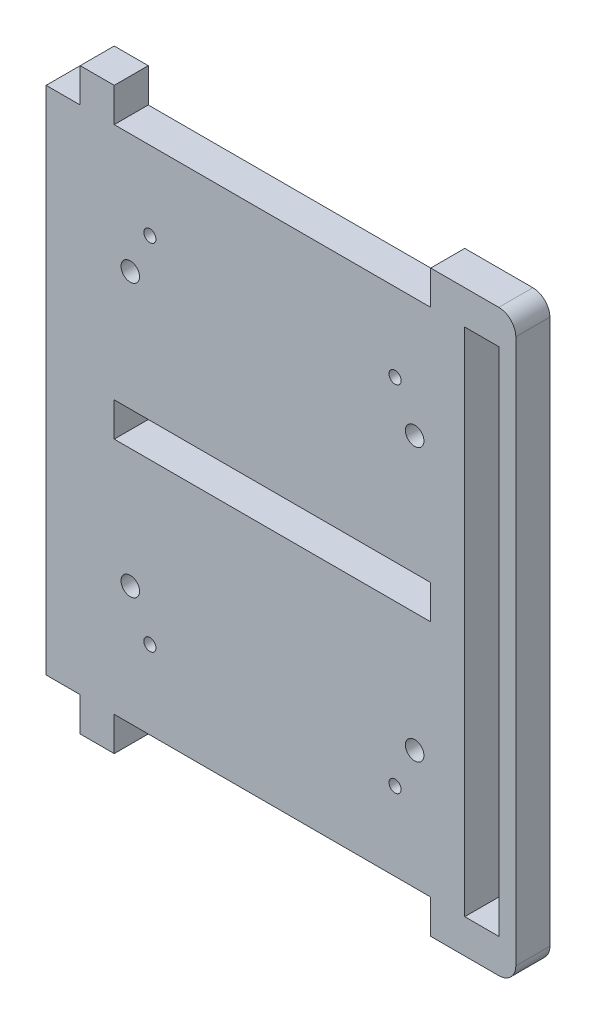
ISO-10303-21;
HEADER;
FILE_DESCRIPTION(('STEP AP214'),'2;1');
FILE_NAME('part.step','',(''),(''),'','','');
FILE_SCHEMA(('AUTOMOTIVE_DESIGN { 1 0 10303 214 1 1 1 1 }'));
ENDSEC;
DATA;
#1=APPLICATION_CONTEXT('core data for automotive mechanical design processes');
#2=APPLICATION_PROTOCOL_DEFINITION('international standard','automotive_design',2000,#1);
#3=PRODUCT_CONTEXT('',#1,'mechanical');
#4=PRODUCT('Part','Part','',(#3));
#5=PRODUCT_RELATED_PRODUCT_CATEGORY('part','',(#4));
#6=PRODUCT_DEFINITION_FORMATION('','',#4);
#7=PRODUCT_DEFINITION_CONTEXT('part definition',#1,'design');
#8=PRODUCT_DEFINITION('design','',#6,#7);
#9=PRODUCT_DEFINITION_SHAPE('','',#8);
#10=(LENGTH_UNIT() NAMED_UNIT(*) SI_UNIT(.MILLI.,.METRE.));
#11=(NAMED_UNIT(*) PLANE_ANGLE_UNIT() SI_UNIT($,.RADIAN.));
#12=(NAMED_UNIT(*) SI_UNIT($,.STERADIAN.) SOLID_ANGLE_UNIT());
#13=UNCERTAINTY_MEASURE_WITH_UNIT(LENGTH_MEASURE(1.E-05),#10,'distance_accuracy_value','');
#14=(GEOMETRIC_REPRESENTATION_CONTEXT(3) GLOBAL_UNCERTAINTY_ASSIGNED_CONTEXT((#13)) GLOBAL_UNIT_ASSIGNED_CONTEXT((#10,
#11,#12)) REPRESENTATION_CONTEXT('',''));
#15=CARTESIAN_POINT('',(0.,0.,0.));
#16=DIRECTION('',(0.,0.,1.));
#17=DIRECTION('',(1.,0.,0.));
#18=AXIS2_PLACEMENT_3D('',#15,#16,#17);
#19=CARTESIAN_POINT('',(41.6639375,104.775,6.35));
#20=DIRECTION('',(0.,0.,-1.));
#21=DIRECTION('',(-1.,0.,0.));
#22=AXIS2_PLACEMENT_3D('',#19,#20,#21);
#23=PLANE('',#22);
#24=CARTESIAN_POINT('',(-23.40848125,86.9949999999999,6.34999999999999));
#25=DIRECTION('',(0.,0.,-1.));
#26=DIRECTION('',(-1.,0.,0.));
#27=AXIS2_PLACEMENT_3D('',#24,#25,#26);
#28=CIRCLE('',#27,1.13029999999999);
#29=CARTESIAN_POINT('',(-24.53878125,86.9949999999999,6.34999999999999));
#30=VERTEX_POINT('',#29);
#31=EDGE_CURVE('E808',#30,#30,#28,.T.);
#32=ORIENTED_EDGE('',*,*,#31,.T.);
#33=EDGE_LOOP('',(#32));
#34=FACE_BOUND('',#33,.T.);
#35=CARTESIAN_POINT('',(-23.40848125,20.9549999999999,6.34999999999999));
#36=DIRECTION('',(0.,0.,-1.));
#37=DIRECTION('',(-1.,0.,0.));
#38=AXIS2_PLACEMENT_3D('',#35,#36,#37);
#39=CIRCLE('',#38,1.13029999999999);
#40=CARTESIAN_POINT('',(-24.53878125,20.9549999999999,6.34999999999999));
#41=VERTEX_POINT('',#40);
#42=EDGE_CURVE('E818',#41,#41,#39,.T.);
#43=ORIENTED_EDGE('',*,*,#42,.T.);
#44=EDGE_LOOP('',(#43));
#45=FACE_BOUND('',#44,.T.);
#46=CARTESIAN_POINT('',(22.31151875,20.9549999999999,6.34999999999999));
#47=DIRECTION('',(0.,0.,-1.));
#48=DIRECTION('',(-1.,0.,0.));
#49=AXIS2_PLACEMENT_3D('',#46,#47,#48);
#50=CIRCLE('',#49,1.13029999999999);
#51=CARTESIAN_POINT('',(21.18121875,20.9549999999999,6.34999999999999));
#52=VERTEX_POINT('',#51);
#53=EDGE_CURVE('E824',#52,#52,#50,.T.);
#54=ORIENTED_EDGE('',*,*,#53,.T.);
#55=EDGE_LOOP('',(#54));
#56=FACE_BOUND('',#55,.T.);
#57=CARTESIAN_POINT('',(22.31151875,86.9949999999999,6.34999999999999));
#58=DIRECTION('',(0.,0.,-1.));
#59=DIRECTION('',(-1.,0.,0.));
#60=AXIS2_PLACEMENT_3D('',#57,#58,#59);
#61=CIRCLE('',#60,1.13029999999999);
#62=CARTESIAN_POINT('',(21.18121875,86.9949999999999,6.34999999999999));
#63=VERTEX_POINT('',#62);
#64=EDGE_CURVE('E830',#63,#63,#61,.T.);
#65=ORIENTED_EDGE('',*,*,#64,.T.);
#66=EDGE_LOOP('',(#65));
#67=FACE_BOUND('',#66,.T.);
#68=CARTESIAN_POINT('',(25.9730875,79.375,6.34999999999999));
#69=DIRECTION('',(0.,0.,-1.));
#70=DIRECTION('',(-1.,0.,0.));
#71=AXIS2_PLACEMENT_3D('',#68,#69,#70);
#72=CIRCLE('',#71,1.72719999999998);
#73=CARTESIAN_POINT('',(24.2458875,79.375,6.34999999999999));
#74=VERTEX_POINT('',#73);
#75=EDGE_CURVE('E836',#74,#74,#72,.T.);
#76=ORIENTED_EDGE('',*,*,#75,.T.);
#77=EDGE_LOOP('',(#76));
#78=FACE_BOUND('',#77,.T.);
#79=CARTESIAN_POINT('',(25.9730875,28.575,6.34999999999999));
#80=DIRECTION('',(0.,0.,-1.));
#81=DIRECTION('',(-1.,0.,0.));
#82=AXIS2_PLACEMENT_3D('',#79,#80,#81);
#83=CIRCLE('',#82,1.72719999999998);
#84=CARTESIAN_POINT('',(24.2458875000001,28.575,6.34999999999999));
#85=VERTEX_POINT('',#84);
#86=EDGE_CURVE('E842',#85,#85,#83,.T.);
#87=ORIENTED_EDGE('',*,*,#86,.T.);
#88=EDGE_LOOP('',(#87));
#89=FACE_BOUND('',#88,.T.);
#90=CARTESIAN_POINT('',(-27.0700500000001,28.5750000000001,6.34999999999999));
#91=DIRECTION('',(0.,0.,-1.));
#92=DIRECTION('',(-1.,0.,0.));
#93=AXIS2_PLACEMENT_3D('',#90,#91,#92);
#94=CIRCLE('',#93,1.72719999999998);
#95=CARTESIAN_POINT('',(-28.7972500000001,28.5750000000001,6.34999999999999));
#96=VERTEX_POINT('',#95);
#97=EDGE_CURVE('E848',#96,#96,#94,.T.);
#98=ORIENTED_EDGE('',*,*,#97,.T.);
#99=EDGE_LOOP('',(#98));
#100=FACE_BOUND('',#99,.T.);
#101=CARTESIAN_POINT('',(-27.0700500000001,79.375,6.34999999999999));
#102=DIRECTION('',(0.,0.,-1.));
#103=DIRECTION('',(-1.,0.,0.));
#104=AXIS2_PLACEMENT_3D('',#101,#102,#103);
#105=CIRCLE('',#104,1.72719999999998);
#106=CARTESIAN_POINT('',(-28.7972500000001,79.375,6.34999999999999));
#107=VERTEX_POINT('',#106);
#108=EDGE_CURVE('E236',#107,#107,#105,.T.);
#109=ORIENTED_EDGE('',*,*,#108,.T.);
#110=EDGE_LOOP('',(#109));
#111=FACE_BOUND('',#110,.T.);
#112=DIRECTION('',(-1.,0.,0.));
#113=VECTOR('',#112,1.);
#114=CARTESIAN_POINT('',(41.6639375,101.6,6.35));
#115=LINE('',#114,#113);
#116=CARTESIAN_POINT('',(41.6639375,101.6,6.35));
#117=VERTEX_POINT('',#116);
#118=CARTESIAN_POINT('',(35.3139375,101.6,6.35));
#119=VERTEX_POINT('',#118);
#120=EDGE_CURVE('E246',#117,#119,#115,.T.);
#121=ORIENTED_EDGE('',*,*,#120,.F.);
#122=DIRECTION('',(0.,1.,0.));
#123=VECTOR('',#122,1.);
#124=CARTESIAN_POINT('',(41.6639375,6.34999999999999,6.35));
#125=LINE('',#124,#123);
#126=CARTESIAN_POINT('',(41.6639375,6.34999999999999,6.35));
#127=VERTEX_POINT('',#126);
#128=EDGE_CURVE('E254',#127,#117,#125,.T.);
#129=ORIENTED_EDGE('',*,*,#128,.F.);
#130=DIRECTION('',(1.,0.,0.));
#131=VECTOR('',#130,1.);
#132=CARTESIAN_POINT('',(35.3139375,6.34999999999999,6.35));
#133=LINE('',#132,#131);
#134=CARTESIAN_POINT('',(35.3139375,6.34999999999999,6.35));
#135=VERTEX_POINT('',#134);
#136=EDGE_CURVE('E251',#135,#127,#133,.T.);
#137=ORIENTED_EDGE('',*,*,#136,.F.);
#138=DIRECTION('',(0.,-1.,0.));
#139=VECTOR('',#138,1.);
#140=CARTESIAN_POINT('',(35.3139375,101.6,6.35));
#141=LINE('',#140,#139);
#142=EDGE_CURVE('E248',#119,#135,#141,.T.);
#143=ORIENTED_EDGE('',*,*,#142,.F.);
#144=EDGE_LOOP('',(#121,#129,#137,#143));
#145=FACE_BOUND('',#144,.T.);
#146=DIRECTION('',(0.,-1.,0.));
#147=VECTOR('',#146,1.);
#148=CARTESIAN_POINT('',(-36.4109,0.,6.35));
#149=LINE('',#148,#147);
#150=CARTESIAN_POINT('',(-36.4109,6.35,6.35));
#151=VERTEX_POINT('',#150);
#152=CARTESIAN_POINT('',(-36.4109,0.,6.35));
#153=VERTEX_POINT('',#152);
#154=EDGE_CURVE('E277',#151,#153,#149,.T.);
#155=ORIENTED_EDGE('',*,*,#154,.T.);
#156=DIRECTION('',(1.,0.,0.));
#157=VECTOR('',#156,1.);
#158=CARTESIAN_POINT('',(-36.4109,0.,6.35));
#159=LINE('',#158,#157);
#160=CARTESIAN_POINT('',(-30.0609,0.,6.35));
#161=VERTEX_POINT('',#160);
#162=EDGE_CURVE('E280',#153,#161,#159,.T.);
#163=ORIENTED_EDGE('',*,*,#162,.T.);
#164=DIRECTION('',(0.,1.,0.));
#165=VECTOR('',#164,1.);
#166=CARTESIAN_POINT('',(-30.0609,6.35,6.35));
#167=LINE('',#166,#165);
#168=CARTESIAN_POINT('',(-30.0609,6.35,6.35));
#169=VERTEX_POINT('',#168);
#170=EDGE_CURVE('E283',#161,#169,#167,.T.);
#171=ORIENTED_EDGE('',*,*,#170,.T.);
#172=DIRECTION('',(1.,0.,0.));
#173=VECTOR('',#172,1.);
#174=CARTESIAN_POINT('',(28.9639375,6.35,6.35));
#175=LINE('',#174,#173);
#176=CARTESIAN_POINT('',(28.9639375,6.35,6.35));
#177=VERTEX_POINT('',#176);
#178=EDGE_CURVE('E285',#169,#177,#175,.T.);
#179=ORIENTED_EDGE('',*,*,#178,.T.);
#180=DIRECTION('',(0.,-1.,0.));
#181=VECTOR('',#180,1.);
#182=CARTESIAN_POINT('',(28.9639375,0.,6.35));
#183=LINE('',#182,#181);
#184=CARTESIAN_POINT('',(28.9639375,0.,6.35));
#185=VERTEX_POINT('',#184);
#186=EDGE_CURVE('E287',#177,#185,#183,.T.);
#187=ORIENTED_EDGE('',*,*,#186,.T.);
#188=DIRECTION('',(1.,0.,0.));
#189=VECTOR('',#188,1.);
#190=CARTESIAN_POINT('',(28.9639375,0.,6.35));
#191=LINE('',#190,#189);
#192=CARTESIAN_POINT('',(41.6639375,0.,6.35));
#193=VERTEX_POINT('',#192);
#194=EDGE_CURVE('E289',#185,#193,#191,.T.);
#195=ORIENTED_EDGE('',*,*,#194,.T.);
#196=CARTESIAN_POINT('',(41.6639375,3.175,6.35));
#197=DIRECTION('',(0.,0.,1.));
#198=DIRECTION('',(1.,0.,0.));
#199=AXIS2_PLACEMENT_3D('',#196,#197,#198);
#200=CIRCLE('',#199,3.175);
#201=CARTESIAN_POINT('',(44.8389375,3.17500000000002,6.35));
#202=VERTEX_POINT('',#201);
#203=EDGE_CURVE('E291',#193,#202,#200,.T.);
#204=ORIENTED_EDGE('',*,*,#203,.T.);
#205=DIRECTION('',(0.,1.,0.));
#206=VECTOR('',#205,1.);
#207=CARTESIAN_POINT('',(44.8389375,3.17500000000002,6.35));
#208=LINE('',#207,#206);
#209=CARTESIAN_POINT('',(44.8389375,104.775,6.35));
#210=VERTEX_POINT('',#209);
#211=EDGE_CURVE('E293',#202,#210,#208,.T.);
#212=ORIENTED_EDGE('',*,*,#211,.T.);
#213=CARTESIAN_POINT('',(41.6639375,104.775,6.35));
#214=DIRECTION('',(0.,0.,1.));
#215=DIRECTION('',(-1.,0.,0.));
#216=AXIS2_PLACEMENT_3D('',#213,#214,#215);
#217=CIRCLE('',#216,3.175);
#218=CARTESIAN_POINT('',(41.6639375,107.95,6.35));
#219=VERTEX_POINT('',#218);
#220=EDGE_CURVE('E295',#210,#219,#217,.T.);
#221=ORIENTED_EDGE('',*,*,#220,.T.);
#222=DIRECTION('',(-1.,0.,0.));
#223=VECTOR('',#222,1.);
#224=CARTESIAN_POINT('',(28.9639375,107.95,6.35));
#225=LINE('',#224,#223);
#226=CARTESIAN_POINT('',(28.9639375,107.95,6.35));
#227=VERTEX_POINT('',#226);
#228=EDGE_CURVE('E297',#219,#227,#225,.T.);
#229=ORIENTED_EDGE('',*,*,#228,.T.);
#230=DIRECTION('',(0.,-1.,0.));
#231=VECTOR('',#230,1.);
#232=CARTESIAN_POINT('',(28.9639375,101.6,6.35));
#233=LINE('',#232,#231);
#234=CARTESIAN_POINT('',(28.9639375,101.6,6.35));
#235=VERTEX_POINT('',#234);
#236=EDGE_CURVE('E299',#227,#235,#233,.T.);
#237=ORIENTED_EDGE('',*,*,#236,.T.);
#238=DIRECTION('',(-1.,0.,0.));
#239=VECTOR('',#238,1.);
#240=CARTESIAN_POINT('',(-30.0609,101.6,6.35));
#241=LINE('',#240,#239);
#242=CARTESIAN_POINT('',(-30.0609,101.6,6.35));
#243=VERTEX_POINT('',#242);
#244=EDGE_CURVE('E301',#235,#243,#241,.T.);
#245=ORIENTED_EDGE('',*,*,#244,.T.);
#246=DIRECTION('',(0.,1.,0.));
#247=VECTOR('',#246,1.);
#248=CARTESIAN_POINT('',(-30.0609,107.95,6.35));
#249=LINE('',#248,#247);
#250=CARTESIAN_POINT('',(-30.0609,107.95,6.35));
#251=VERTEX_POINT('',#250);
#252=EDGE_CURVE('E303',#243,#251,#249,.T.);
#253=ORIENTED_EDGE('',*,*,#252,.T.);
#254=DIRECTION('',(-1.,0.,0.));
#255=VECTOR('',#254,1.);
#256=CARTESIAN_POINT('',(-36.4109,107.95,6.35));
#257=LINE('',#256,#255);
#258=CARTESIAN_POINT('',(-36.4109,107.95,6.35));
#259=VERTEX_POINT('',#258);
#260=EDGE_CURVE('E305',#251,#259,#257,.T.);
#261=ORIENTED_EDGE('',*,*,#260,.T.);
#262=DIRECTION('',(0.,-1.,0.));
#263=VECTOR('',#262,1.);
#264=CARTESIAN_POINT('',(-36.4109,101.6,6.35));
#265=LINE('',#264,#263);
#266=CARTESIAN_POINT('',(-36.4109,101.6,6.35));
#267=VERTEX_POINT('',#266);
#268=EDGE_CURVE('E307',#259,#267,#265,.T.);
#269=ORIENTED_EDGE('',*,*,#268,.T.);
#270=DIRECTION('',(-1.,0.,0.));
#271=VECTOR('',#270,1.);
#272=CARTESIAN_POINT('',(-36.4109,101.6,6.35));
#273=LINE('',#272,#271);
#274=CARTESIAN_POINT('',(-42.7609,101.6,6.35));
#275=VERTEX_POINT('',#274);
#276=EDGE_CURVE('E309',#267,#275,#273,.T.);
#277=ORIENTED_EDGE('',*,*,#276,.T.);
#278=DIRECTION('',(0.,-1.,0.));
#279=VECTOR('',#278,1.);
#280=CARTESIAN_POINT('',(-42.7609,6.35,6.35));
#281=LINE('',#280,#279);
#282=CARTESIAN_POINT('',(-42.7609,6.35,6.35));
#283=VERTEX_POINT('',#282);
#284=EDGE_CURVE('E311',#275,#283,#281,.T.);
#285=ORIENTED_EDGE('',*,*,#284,.T.);
#286=DIRECTION('',(1.,0.,0.));
#287=VECTOR('',#286,1.);
#288=CARTESIAN_POINT('',(-36.4109,6.35,6.35));
#289=LINE('',#288,#287);
#290=EDGE_CURVE('E313',#283,#151,#289,.T.);
#291=ORIENTED_EDGE('',*,*,#290,.T.);
#292=EDGE_LOOP('',(#155,#163,#171,#179,#187,#195,#204,#212,#221,#229,#237,#245,#253,#261,#269,
#277,#285,#291));
#293=FACE_BOUND('',#292,.T.);
#294=DIRECTION('',(0.,-1.,0.));
#295=VECTOR('',#294,1.);
#296=CARTESIAN_POINT('',(-30.0609,57.15,6.35));
#297=LINE('',#296,#295);
#298=CARTESIAN_POINT('',(-30.0609,57.15,6.35));
#299=VERTEX_POINT('',#298);
#300=CARTESIAN_POINT('',(-30.0609,50.8,6.35));
#301=VERTEX_POINT('',#300);
#302=EDGE_CURVE('E208',#299,#301,#297,.T.);
#303=ORIENTED_EDGE('',*,*,#302,.F.);
#304=DIRECTION('',(-1.,0.,0.));
#305=VECTOR('',#304,1.);
#306=CARTESIAN_POINT('',(28.9639375,57.15,6.35));
#307=LINE('',#306,#305);
#308=CARTESIAN_POINT('',(28.9639375,57.15,6.35));
#309=VERTEX_POINT('',#308);
#310=EDGE_CURVE('E230',#309,#299,#307,.T.);
#311=ORIENTED_EDGE('',*,*,#310,.F.);
#312=DIRECTION('',(0.,1.,0.));
#313=VECTOR('',#312,1.);
#314=CARTESIAN_POINT('',(28.9639375,50.8,6.35));
#315=LINE('',#314,#313);
#316=CARTESIAN_POINT('',(28.9639375,50.8,6.35));
#317=VERTEX_POINT('',#316);
#318=EDGE_CURVE('E228',#317,#309,#315,.T.);
#319=ORIENTED_EDGE('',*,*,#318,.F.);
#320=DIRECTION('',(1.,0.,0.));
#321=VECTOR('',#320,1.);
#322=CARTESIAN_POINT('',(-30.0609,50.8,6.35));
#323=LINE('',#322,#321);
#324=EDGE_CURVE('E216',#301,#317,#323,.T.);
#325=ORIENTED_EDGE('',*,*,#324,.F.);
#326=EDGE_LOOP('',(#303,#311,#319,#325));
#327=FACE_BOUND('',#326,.T.);
#328=ADVANCED_FACE('F35',(#34,#45,#56,#67,#78,#89,#100,#111,#145,#293,#327),#23,.F.);
#329=CARTESIAN_POINT('',(41.6639375,104.775,0.));
#330=DIRECTION('',(0.,0.,-1.));
#331=DIRECTION('',(-1.,0.,0.));
#332=AXIS2_PLACEMENT_3D('',#329,#330,#331);
#333=PLANE('',#332);
#334=CARTESIAN_POINT('',(-23.40848125,86.9949999999999,0.));
#335=DIRECTION('',(0.,0.,-1.));
#336=DIRECTION('',(-1.,0.,0.));
#337=AXIS2_PLACEMENT_3D('',#334,#335,#336);
#338=CIRCLE('',#337,1.13029999999999);
#339=CARTESIAN_POINT('',(-24.53878125,86.9949999999999,0.));
#340=VERTEX_POINT('',#339);
#341=EDGE_CURVE('E811',#340,#340,#338,.T.);
#342=ORIENTED_EDGE('',*,*,#341,.F.);
#343=EDGE_LOOP('',(#342));
#344=FACE_BOUND('',#343,.T.);
#345=CARTESIAN_POINT('',(-23.40848125,20.9549999999999,0.));
#346=DIRECTION('',(0.,0.,-1.));
#347=DIRECTION('',(-1.,0.,0.));
#348=AXIS2_PLACEMENT_3D('',#345,#346,#347);
#349=CIRCLE('',#348,1.13029999999999);
#350=CARTESIAN_POINT('',(-24.53878125,20.9549999999999,0.));
#351=VERTEX_POINT('',#350);
#352=EDGE_CURVE('E813',#351,#351,#349,.T.);
#353=ORIENTED_EDGE('',*,*,#352,.F.);
#354=EDGE_LOOP('',(#353));
#355=FACE_BOUND('',#354,.T.);
#356=CARTESIAN_POINT('',(22.31151875,20.9549999999999,0.));
#357=DIRECTION('',(0.,0.,-1.));
#358=DIRECTION('',(-1.,0.,0.));
#359=AXIS2_PLACEMENT_3D('',#356,#357,#358);
#360=CIRCLE('',#359,1.13029999999999);
#361=CARTESIAN_POINT('',(21.18121875,20.9549999999999,0.));
#362=VERTEX_POINT('',#361);
#363=EDGE_CURVE('E821',#362,#362,#360,.T.);
#364=ORIENTED_EDGE('',*,*,#363,.F.);
#365=EDGE_LOOP('',(#364));
#366=FACE_BOUND('',#365,.T.);
#367=CARTESIAN_POINT('',(22.31151875,86.9949999999999,0.));
#368=DIRECTION('',(0.,0.,-1.));
#369=DIRECTION('',(-1.,0.,0.));
#370=AXIS2_PLACEMENT_3D('',#367,#368,#369);
#371=CIRCLE('',#370,1.13029999999999);
#372=CARTESIAN_POINT('',(21.18121875,86.9949999999999,0.));
#373=VERTEX_POINT('',#372);
#374=EDGE_CURVE('E827',#373,#373,#371,.T.);
#375=ORIENTED_EDGE('',*,*,#374,.F.);
#376=EDGE_LOOP('',(#375));
#377=FACE_BOUND('',#376,.T.);
#378=CARTESIAN_POINT('',(25.9730875,79.375,0.));
#379=DIRECTION('',(0.,0.,1.));
#380=DIRECTION('',(1.,0.,0.));
#381=AXIS2_PLACEMENT_3D('',#378,#379,#380);
#382=CIRCLE('',#381,1.72719999999998);
#383=CARTESIAN_POINT('',(27.7002875,79.375,0.));
#384=VERTEX_POINT('',#383);
#385=EDGE_CURVE('E833',#384,#384,#382,.T.);
#386=ORIENTED_EDGE('',*,*,#385,.T.);
#387=EDGE_LOOP('',(#386));
#388=FACE_BOUND('',#387,.T.);
#389=CARTESIAN_POINT('',(25.9730875,28.575,0.));
#390=DIRECTION('',(0.,0.,1.));
#391=DIRECTION('',(1.,0.,0.));
#392=AXIS2_PLACEMENT_3D('',#389,#390,#391);
#393=CIRCLE('',#392,1.72719999999998);
#394=CARTESIAN_POINT('',(27.7002875,28.575,0.));
#395=VERTEX_POINT('',#394);
#396=EDGE_CURVE('E839',#395,#395,#393,.T.);
#397=ORIENTED_EDGE('',*,*,#396,.T.);
#398=EDGE_LOOP('',(#397));
#399=FACE_BOUND('',#398,.T.);
#400=CARTESIAN_POINT('',(-27.0700500000001,28.5750000000001,0.));
#401=DIRECTION('',(0.,0.,1.));
#402=DIRECTION('',(1.,0.,0.));
#403=AXIS2_PLACEMENT_3D('',#400,#401,#402);
#404=CIRCLE('',#403,1.72719999999998);
#405=CARTESIAN_POINT('',(-25.3428500000001,28.5750000000001,0.));
#406=VERTEX_POINT('',#405);
#407=EDGE_CURVE('E845',#406,#406,#404,.T.);
#408=ORIENTED_EDGE('',*,*,#407,.T.);
#409=EDGE_LOOP('',(#408));
#410=FACE_BOUND('',#409,.T.);
#411=CARTESIAN_POINT('',(-27.0700500000001,79.375,0.));
#412=DIRECTION('',(0.,0.,1.));
#413=DIRECTION('',(1.,0.,0.));
#414=AXIS2_PLACEMENT_3D('',#411,#412,#413);
#415=CIRCLE('',#414,1.72719999999998);
#416=CARTESIAN_POINT('',(-25.3428500000001,79.375,0.));
#417=VERTEX_POINT('',#416);
#418=EDGE_CURVE('E851',#417,#417,#415,.T.);
#419=ORIENTED_EDGE('',*,*,#418,.T.);
#420=EDGE_LOOP('',(#419));
#421=FACE_BOUND('',#420,.T.);
#422=DIRECTION('',(0.,1.,0.));
#423=VECTOR('',#422,1.);
#424=CARTESIAN_POINT('',(41.6639375,6.34999999999999,0.));
#425=LINE('',#424,#423);
#426=CARTESIAN_POINT('',(41.6639375,6.34999999999999,0.));
#427=VERTEX_POINT('',#426);
#428=CARTESIAN_POINT('',(41.6639375,101.6,0.));
#429=VERTEX_POINT('',#428);
#430=EDGE_CURVE('E249',#427,#429,#425,.T.);
#431=ORIENTED_EDGE('',*,*,#430,.T.);
#432=DIRECTION('',(-1.,0.,0.));
#433=VECTOR('',#432,1.);
#434=CARTESIAN_POINT('',(41.6639375,101.6,0.));
#435=LINE('',#434,#433);
#436=CARTESIAN_POINT('',(35.3139375,101.6,0.));
#437=VERTEX_POINT('',#436);
#438=EDGE_CURVE('E224',#429,#437,#435,.T.);
#439=ORIENTED_EDGE('',*,*,#438,.T.);
#440=DIRECTION('',(0.,-1.,0.));
#441=VECTOR('',#440,1.);
#442=CARTESIAN_POINT('',(35.3139375,101.6,0.));
#443=LINE('',#442,#441);
#444=CARTESIAN_POINT('',(35.3139375,6.34999999999999,0.));
#445=VERTEX_POINT('',#444);
#446=EDGE_CURVE('E259',#437,#445,#443,.T.);
#447=ORIENTED_EDGE('',*,*,#446,.T.);
#448=DIRECTION('',(1.,0.,0.));
#449=VECTOR('',#448,1.);
#450=CARTESIAN_POINT('',(35.3139375,6.34999999999999,0.));
#451=LINE('',#450,#449);
#452=EDGE_CURVE('E262',#445,#427,#451,.T.);
#453=ORIENTED_EDGE('',*,*,#452,.T.);
#454=EDGE_LOOP('',(#431,#439,#447,#453));
#455=FACE_BOUND('',#454,.T.);
#456=DIRECTION('',(0.,-1.,0.));
#457=VECTOR('',#456,1.);
#458=CARTESIAN_POINT('',(-36.4109,0.,0.));
#459=LINE('',#458,#457);
#460=CARTESIAN_POINT('',(-36.4109,6.35,0.));
#461=VERTEX_POINT('',#460);
#462=CARTESIAN_POINT('',(-36.4109,0.,0.));
#463=VERTEX_POINT('',#462);
#464=EDGE_CURVE('E276',#461,#463,#459,.T.);
#465=ORIENTED_EDGE('',*,*,#464,.F.);
#466=DIRECTION('',(1.,0.,0.));
#467=VECTOR('',#466,1.);
#468=CARTESIAN_POINT('',(-36.4109,6.35,0.));
#469=LINE('',#468,#467);
#470=CARTESIAN_POINT('',(-42.7609,6.35,0.));
#471=VERTEX_POINT('',#470);
#472=EDGE_CURVE('E281',#471,#461,#469,.T.);
#473=ORIENTED_EDGE('',*,*,#472,.F.);
#474=DIRECTION('',(0.,-1.,0.));
#475=VECTOR('',#474,1.);
#476=CARTESIAN_POINT('',(-42.7609,6.35,0.));
#477=LINE('',#476,#475);
#478=CARTESIAN_POINT('',(-42.7609,101.6,0.));
#479=VERTEX_POINT('',#478);
#480=EDGE_CURVE('E348',#479,#471,#477,.T.);
#481=ORIENTED_EDGE('',*,*,#480,.F.);
#482=DIRECTION('',(-1.,0.,0.));
#483=VECTOR('',#482,1.);
#484=CARTESIAN_POINT('',(-36.4109,101.6,0.));
#485=LINE('',#484,#483);
#486=CARTESIAN_POINT('',(-36.4109,101.6,0.));
#487=VERTEX_POINT('',#486);
#488=EDGE_CURVE('E346',#487,#479,#485,.T.);
#489=ORIENTED_EDGE('',*,*,#488,.F.);
#490=DIRECTION('',(0.,-1.,0.));
#491=VECTOR('',#490,1.);
#492=CARTESIAN_POINT('',(-36.4109,101.6,0.));
#493=LINE('',#492,#491);
#494=CARTESIAN_POINT('',(-36.4109,107.95,0.));
#495=VERTEX_POINT('',#494);
#496=EDGE_CURVE('E344',#495,#487,#493,.T.);
#497=ORIENTED_EDGE('',*,*,#496,.F.);
#498=DIRECTION('',(-1.,0.,0.));
#499=VECTOR('',#498,1.);
#500=CARTESIAN_POINT('',(-36.4109,107.95,0.));
#501=LINE('',#500,#499);
#502=CARTESIAN_POINT('',(-30.0609,107.95,0.));
#503=VERTEX_POINT('',#502);
#504=EDGE_CURVE('E342',#503,#495,#501,.T.);
#505=ORIENTED_EDGE('',*,*,#504,.F.);
#506=DIRECTION('',(0.,1.,0.));
#507=VECTOR('',#506,1.);
#508=CARTESIAN_POINT('',(-30.0609,107.95,0.));
#509=LINE('',#508,#507);
#510=CARTESIAN_POINT('',(-30.0609,101.6,0.));
#511=VERTEX_POINT('',#510);
#512=EDGE_CURVE('E340',#511,#503,#509,.T.);
#513=ORIENTED_EDGE('',*,*,#512,.F.);
#514=DIRECTION('',(-1.,0.,0.));
#515=VECTOR('',#514,1.);
#516=CARTESIAN_POINT('',(-30.0609,101.6,0.));
#517=LINE('',#516,#515);
#518=CARTESIAN_POINT('',(28.9639375,101.6,0.));
#519=VERTEX_POINT('',#518);
#520=EDGE_CURVE('E338',#519,#511,#517,.T.);
#521=ORIENTED_EDGE('',*,*,#520,.F.);
#522=DIRECTION('',(0.,-1.,0.));
#523=VECTOR('',#522,1.);
#524=CARTESIAN_POINT('',(28.9639375,101.6,0.));
#525=LINE('',#524,#523);
#526=CARTESIAN_POINT('',(28.9639375,107.95,0.));
#527=VERTEX_POINT('',#526);
#528=EDGE_CURVE('E336',#527,#519,#525,.T.);
#529=ORIENTED_EDGE('',*,*,#528,.F.);
#530=DIRECTION('',(-1.,0.,0.));
#531=VECTOR('',#530,1.);
#532=CARTESIAN_POINT('',(28.9639375,107.95,0.));
#533=LINE('',#532,#531);
#534=CARTESIAN_POINT('',(41.6639375,107.95,0.));
#535=VERTEX_POINT('',#534);
#536=EDGE_CURVE('E334',#535,#527,#533,.T.);
#537=ORIENTED_EDGE('',*,*,#536,.F.);
#538=CARTESIAN_POINT('',(41.6639375,104.775,0.));
#539=DIRECTION('',(0.,0.,1.));
#540=DIRECTION('',(-1.,0.,0.));
#541=AXIS2_PLACEMENT_3D('',#538,#539,#540);
#542=CIRCLE('',#541,3.175);
#543=CARTESIAN_POINT('',(44.8389375,104.775,0.));
#544=VERTEX_POINT('',#543);
#545=EDGE_CURVE('E332',#544,#535,#542,.T.);
#546=ORIENTED_EDGE('',*,*,#545,.F.);
#547=DIRECTION('',(0.,1.,0.));
#548=VECTOR('',#547,1.);
#549=CARTESIAN_POINT('',(44.8389375,3.17500000000002,0.));
#550=LINE('',#549,#548);
#551=CARTESIAN_POINT('',(44.8389375,3.17500000000002,0.));
#552=VERTEX_POINT('',#551);
#553=EDGE_CURVE('E330',#552,#544,#550,.T.);
#554=ORIENTED_EDGE('',*,*,#553,.F.);
#555=CARTESIAN_POINT('',(41.6639375,3.175,0.));
#556=DIRECTION('',(0.,0.,1.));
#557=DIRECTION('',(1.,0.,0.));
#558=AXIS2_PLACEMENT_3D('',#555,#556,#557);
#559=CIRCLE('',#558,3.175);
#560=CARTESIAN_POINT('',(41.6639375,0.,0.));
#561=VERTEX_POINT('',#560);
#562=EDGE_CURVE('E328',#561,#552,#559,.T.);
#563=ORIENTED_EDGE('',*,*,#562,.F.);
#564=DIRECTION('',(1.,0.,0.));
#565=VECTOR('',#564,1.);
#566=CARTESIAN_POINT('',(28.9639375,0.,0.));
#567=LINE('',#566,#565);
#568=CARTESIAN_POINT('',(28.9639375,0.,0.));
#569=VERTEX_POINT('',#568);
#570=EDGE_CURVE('E326',#569,#561,#567,.T.);
#571=ORIENTED_EDGE('',*,*,#570,.F.);
#572=DIRECTION('',(0.,-1.,0.));
#573=VECTOR('',#572,1.);
#574=CARTESIAN_POINT('',(28.9639375,0.,0.));
#575=LINE('',#574,#573);
#576=CARTESIAN_POINT('',(28.9639375,6.35,0.));
#577=VERTEX_POINT('',#576);
#578=EDGE_CURVE('E324',#577,#569,#575,.T.);
#579=ORIENTED_EDGE('',*,*,#578,.F.);
#580=DIRECTION('',(1.,0.,0.));
#581=VECTOR('',#580,1.);
#582=CARTESIAN_POINT('',(28.9639375,6.35,0.));
#583=LINE('',#582,#581);
#584=CARTESIAN_POINT('',(-30.0609,6.35,0.));
#585=VERTEX_POINT('',#584);
#586=EDGE_CURVE('E322',#585,#577,#583,.T.);
#587=ORIENTED_EDGE('',*,*,#586,.F.);
#588=DIRECTION('',(0.,1.,0.));
#589=VECTOR('',#588,1.);
#590=CARTESIAN_POINT('',(-30.0609,6.35,0.));
#591=LINE('',#590,#589);
#592=CARTESIAN_POINT('',(-30.0609,0.,0.));
#593=VERTEX_POINT('',#592);
#594=EDGE_CURVE('E320',#593,#585,#591,.T.);
#595=ORIENTED_EDGE('',*,*,#594,.F.);
#596=DIRECTION('',(1.,0.,0.));
#597=VECTOR('',#596,1.);
#598=CARTESIAN_POINT('',(-36.4109,0.,0.));
#599=LINE('',#598,#597);
#600=EDGE_CURVE('E318',#463,#593,#599,.T.);
#601=ORIENTED_EDGE('',*,*,#600,.F.);
#602=EDGE_LOOP('',(#465,#473,#481,#489,#497,#505,#513,#521,#529,#537,#546,#554,#563,#571,#579,
#587,#595,#601));
#603=FACE_BOUND('',#602,.T.);
#604=DIRECTION('',(-1.,0.,0.));
#605=VECTOR('',#604,1.);
#606=CARTESIAN_POINT('',(28.9639375,57.15,0.));
#607=LINE('',#606,#605);
#608=CARTESIAN_POINT('',(28.9639375,57.15,0.));
#609=VERTEX_POINT('',#608);
#610=CARTESIAN_POINT('',(-30.0609,57.15,0.));
#611=VERTEX_POINT('',#610);
#612=EDGE_CURVE('E217',#609,#611,#607,.T.);
#613=ORIENTED_EDGE('',*,*,#612,.T.);
#614=DIRECTION('',(0.,-1.,0.));
#615=VECTOR('',#614,1.);
#616=CARTESIAN_POINT('',(-30.0609,57.15,0.));
#617=LINE('',#616,#615);
#618=CARTESIAN_POINT('',(-30.0609,50.8,0.));
#619=VERTEX_POINT('',#618);
#620=EDGE_CURVE('E58',#611,#619,#617,.T.);
#621=ORIENTED_EDGE('',*,*,#620,.T.);
#622=DIRECTION('',(1.,0.,0.));
#623=VECTOR('',#622,1.);
#624=CARTESIAN_POINT('',(-30.0609,50.8,0.));
#625=LINE('',#624,#623);
#626=CARTESIAN_POINT('',(28.9639375,50.8,0.));
#627=VERTEX_POINT('',#626);
#628=EDGE_CURVE('E223',#619,#627,#625,.T.);
#629=ORIENTED_EDGE('',*,*,#628,.T.);
#630=DIRECTION('',(0.,1.,0.));
#631=VECTOR('',#630,1.);
#632=CARTESIAN_POINT('',(28.9639375,50.8,0.));
#633=LINE('',#632,#631);
#634=EDGE_CURVE('E238',#627,#609,#633,.T.);
#635=ORIENTED_EDGE('',*,*,#634,.T.);
#636=EDGE_LOOP('',(#613,#621,#629,#635));
#637=FACE_BOUND('',#636,.T.);
#638=ADVANCED_FACE('F408',(#344,#355,#366,#377,#388,#399,#410,#421,#455,#603,#637),#333,.T.);
#639=CARTESIAN_POINT('',(-36.4109,0.,6.35));
#640=DIRECTION('',(1.,0.,0.));
#641=DIRECTION('',(0.,0.,-1.));
#642=AXIS2_PLACEMENT_3D('',#639,#640,#641);
#643=PLANE('',#642);
#644=ORIENTED_EDGE('',*,*,#464,.T.);
#645=DIRECTION('',(0.,0.,-1.));
#646=VECTOR('',#645,1.);
#647=CARTESIAN_POINT('',(-36.4109,0.,6.35));
#648=LINE('',#647,#646);
#649=EDGE_CURVE('E11',#153,#463,#648,.T.);
#650=ORIENTED_EDGE('',*,*,#649,.F.);
#651=ORIENTED_EDGE('',*,*,#154,.F.);
#652=DIRECTION('',(0.,0.,-1.));
#653=VECTOR('',#652,1.);
#654=CARTESIAN_POINT('',(-36.4109,6.35,6.35));
#655=LINE('',#654,#653);
#656=EDGE_CURVE('E315',#151,#461,#655,.T.);
#657=ORIENTED_EDGE('',*,*,#656,.T.);
#658=EDGE_LOOP('',(#644,#650,#651,#657));
#659=FACE_BOUND('',#658,.T.);
#660=ADVANCED_FACE('F37',(#659),#643,.F.);
#661=CARTESIAN_POINT('',(-36.4109,0.,6.35));
#662=DIRECTION('',(0.,1.,0.));
#663=DIRECTION('',(-1.,0.,0.));
#664=AXIS2_PLACEMENT_3D('',#661,#662,#663);
#665=PLANE('',#664);
#666=ORIENTED_EDGE('',*,*,#600,.T.);
#667=DIRECTION('',(0.,0.,-1.));
#668=VECTOR('',#667,1.);
#669=CARTESIAN_POINT('',(-30.0609,0.,6.35));
#670=LINE('',#669,#668);
#671=EDGE_CURVE('E43',#161,#593,#670,.T.);
#672=ORIENTED_EDGE('',*,*,#671,.F.);
#673=ORIENTED_EDGE('',*,*,#162,.F.);
#674=ORIENTED_EDGE('',*,*,#649,.T.);
#675=EDGE_LOOP('',(#666,#672,#673,#674));
#676=FACE_BOUND('',#675,.T.);
#677=ADVANCED_FACE('F425',(#676),#665,.F.);
#678=CARTESIAN_POINT('',(-30.0609,6.35,6.35));
#679=DIRECTION('',(-1.,0.,0.));
#680=DIRECTION('',(0.,0.,1.));
#681=AXIS2_PLACEMENT_3D('',#678,#679,#680);
#682=PLANE('',#681);
#683=ORIENTED_EDGE('',*,*,#594,.T.);
#684=DIRECTION('',(0.,0.,-1.));
#685=VECTOR('',#684,1.);
#686=CARTESIAN_POINT('',(-30.0609,6.35,6.35));
#687=LINE('',#686,#685);
#688=EDGE_CURVE('E395',#169,#585,#687,.T.);
#689=ORIENTED_EDGE('',*,*,#688,.F.);
#690=ORIENTED_EDGE('',*,*,#170,.F.);
#691=ORIENTED_EDGE('',*,*,#671,.T.);
#692=EDGE_LOOP('',(#683,#689,#690,#691));
#693=FACE_BOUND('',#692,.T.);
#694=ADVANCED_FACE('F402',(#693),#682,.F.);
#695=CARTESIAN_POINT('',(28.9639375,6.35,6.35));
#696=DIRECTION('',(0.,1.,0.));
#697=DIRECTION('',(0.,0.,1.));
#698=AXIS2_PLACEMENT_3D('',#695,#696,#697);
#699=PLANE('',#698);
#700=ORIENTED_EDGE('',*,*,#586,.T.);
#701=DIRECTION('',(0.,0.,-1.));
#702=VECTOR('',#701,1.);
#703=CARTESIAN_POINT('',(28.9639375,6.35,6.35));
#704=LINE('',#703,#702);
#705=EDGE_CURVE('E392',#177,#577,#704,.T.);
#706=ORIENTED_EDGE('',*,*,#705,.F.);
#707=ORIENTED_EDGE('',*,*,#178,.F.);
#708=ORIENTED_EDGE('',*,*,#688,.T.);
#709=EDGE_LOOP('',(#700,#706,#707,#708));
#710=FACE_BOUND('',#709,.T.);
#711=ADVANCED_FACE('F414',(#710),#699,.F.);
#712=CARTESIAN_POINT('',(28.9639375,0.,6.35));
#713=DIRECTION('',(1.,0.,0.));
#714=DIRECTION('',(0.,0.,-1.));
#715=AXIS2_PLACEMENT_3D('',#712,#713,#714);
#716=PLANE('',#715);
#717=ORIENTED_EDGE('',*,*,#578,.T.);
#718=DIRECTION('',(0.,0.,-1.));
#719=VECTOR('',#718,1.);
#720=CARTESIAN_POINT('',(28.9639375,0.,6.35));
#721=LINE('',#720,#719);
#722=EDGE_CURVE('E389',#185,#569,#721,.T.);
#723=ORIENTED_EDGE('',*,*,#722,.F.);
#724=ORIENTED_EDGE('',*,*,#186,.F.);
#725=ORIENTED_EDGE('',*,*,#705,.T.);
#726=EDGE_LOOP('',(#717,#723,#724,#725));
#727=FACE_BOUND('',#726,.T.);
#728=ADVANCED_FACE('F418',(#727),#716,.F.);
#729=CARTESIAN_POINT('',(28.9639375,0.,6.35));
#730=DIRECTION('',(0.,1.,0.));
#731=DIRECTION('',(-1.,0.,0.));
#732=AXIS2_PLACEMENT_3D('',#729,#730,#731);
#733=PLANE('',#732);
#734=ORIENTED_EDGE('',*,*,#570,.T.);
#735=DIRECTION('',(0.,0.,-1.));
#736=VECTOR('',#735,1.);
#737=CARTESIAN_POINT('',(41.6639375,0.,6.35));
#738=LINE('',#737,#736);
#739=EDGE_CURVE('E386',#193,#561,#738,.T.);
#740=ORIENTED_EDGE('',*,*,#739,.F.);
#741=ORIENTED_EDGE('',*,*,#194,.F.);
#742=ORIENTED_EDGE('',*,*,#722,.T.);
#743=EDGE_LOOP('',(#734,#740,#741,#742));
#744=FACE_BOUND('',#743,.T.);
#745=ADVANCED_FACE('F488',(#744),#733,.F.);
#746=CARTESIAN_POINT('',(41.6639375,3.175,6.35));
#747=DIRECTION('',(0.,0.,-1.));
#748=DIRECTION('',(-1.,0.,0.));
#749=AXIS2_PLACEMENT_3D('',#746,#747,#748);
#750=CYLINDRICAL_SURFACE('',#749,3.175);
#751=ORIENTED_EDGE('',*,*,#562,.T.);
#752=DIRECTION('',(0.,0.,-1.));
#753=VECTOR('',#752,1.);
#754=CARTESIAN_POINT('',(44.8389375,3.17500000000002,6.35));
#755=LINE('',#754,#753);
#756=EDGE_CURVE('E383',#202,#552,#755,.T.);
#757=ORIENTED_EDGE('',*,*,#756,.F.);
#758=ORIENTED_EDGE('',*,*,#203,.F.);
#759=ORIENTED_EDGE('',*,*,#739,.T.);
#760=EDGE_LOOP('',(#751,#757,#758,#759));
#761=FACE_BOUND('',#760,.T.);
#762=ADVANCED_FACE('F486',(#761),#750,.T.);
#763=CARTESIAN_POINT('',(44.8389375,3.17500000000002,6.35));
#764=DIRECTION('',(-1.,0.,0.));
#765=DIRECTION('',(0.,0.,1.));
#766=AXIS2_PLACEMENT_3D('',#763,#764,#765);
#767=PLANE('',#766);
#768=ORIENTED_EDGE('',*,*,#553,.T.);
#769=DIRECTION('',(0.,0.,-1.));
#770=VECTOR('',#769,1.);
#771=CARTESIAN_POINT('',(44.8389375,104.775,6.35));
#772=LINE('',#771,#770);
#773=EDGE_CURVE('E380',#210,#544,#772,.T.);
#774=ORIENTED_EDGE('',*,*,#773,.F.);
#775=ORIENTED_EDGE('',*,*,#211,.F.);
#776=ORIENTED_EDGE('',*,*,#756,.T.);
#777=EDGE_LOOP('',(#768,#774,#775,#776));
#778=FACE_BOUND('',#777,.T.);
#779=ADVANCED_FACE('F482',(#778),#767,.F.);
#780=CARTESIAN_POINT('',(41.6639375,104.775,6.35));
#781=DIRECTION('',(0.,0.,-1.));
#782=DIRECTION('',(-1.,0.,0.));
#783=AXIS2_PLACEMENT_3D('',#780,#781,#782);
#784=CYLINDRICAL_SURFACE('',#783,3.175);
#785=ORIENTED_EDGE('',*,*,#545,.T.);
#786=DIRECTION('',(0.,0.,-1.));
#787=VECTOR('',#786,1.);
#788=CARTESIAN_POINT('',(41.6639375,107.95,6.35));
#789=LINE('',#788,#787);
#790=EDGE_CURVE('E377',#219,#535,#789,.T.);
#791=ORIENTED_EDGE('',*,*,#790,.F.);
#792=ORIENTED_EDGE('',*,*,#220,.F.);
#793=ORIENTED_EDGE('',*,*,#773,.T.);
#794=EDGE_LOOP('',(#785,#791,#792,#793));
#795=FACE_BOUND('',#794,.T.);
#796=ADVANCED_FACE('F477',(#795),#784,.T.);
#797=CARTESIAN_POINT('',(28.9639375,107.95,6.35));
#798=DIRECTION('',(0.,-1.,0.));
#799=DIRECTION('',(0.,0.,-1.));
#800=AXIS2_PLACEMENT_3D('',#797,#798,#799);
#801=PLANE('',#800);
#802=ORIENTED_EDGE('',*,*,#536,.T.);
#803=DIRECTION('',(0.,0.,-1.));
#804=VECTOR('',#803,1.);
#805=CARTESIAN_POINT('',(28.9639375,107.95,6.35));
#806=LINE('',#805,#804);
#807=EDGE_CURVE('E374',#227,#527,#806,.T.);
#808=ORIENTED_EDGE('',*,*,#807,.F.);
#809=ORIENTED_EDGE('',*,*,#228,.F.);
#810=ORIENTED_EDGE('',*,*,#790,.T.);
#811=EDGE_LOOP('',(#802,#808,#809,#810));
#812=FACE_BOUND('',#811,.T.);
#813=ADVANCED_FACE('F471',(#812),#801,.F.);
#814=CARTESIAN_POINT('',(28.9639375,101.6,6.35));
#815=DIRECTION('',(1.,0.,0.));
#816=DIRECTION('',(0.,0.,-1.));
#817=AXIS2_PLACEMENT_3D('',#814,#815,#816);
#818=PLANE('',#817);
#819=ORIENTED_EDGE('',*,*,#528,.T.);
#820=DIRECTION('',(0.,0.,-1.));
#821=VECTOR('',#820,1.);
#822=CARTESIAN_POINT('',(28.9639375,101.6,6.35));
#823=LINE('',#822,#821);
#824=EDGE_CURVE('E371',#235,#519,#823,.T.);
#825=ORIENTED_EDGE('',*,*,#824,.F.);
#826=ORIENTED_EDGE('',*,*,#236,.F.);
#827=ORIENTED_EDGE('',*,*,#807,.T.);
#828=EDGE_LOOP('',(#819,#825,#826,#827));
#829=FACE_BOUND('',#828,.T.);
#830=ADVANCED_FACE('F467',(#829),#818,.F.);
#831=CARTESIAN_POINT('',(-30.0609,101.6,6.35));
#832=DIRECTION('',(0.,-1.,0.));
#833=DIRECTION('',(0.,0.,-1.));
#834=AXIS2_PLACEMENT_3D('',#831,#832,#833);
#835=PLANE('',#834);
#836=ORIENTED_EDGE('',*,*,#520,.T.);
#837=DIRECTION('',(0.,0.,-1.));
#838=VECTOR('',#837,1.);
#839=CARTESIAN_POINT('',(-30.0609,101.6,6.35));
#840=LINE('',#839,#838);
#841=EDGE_CURVE('E368',#243,#511,#840,.T.);
#842=ORIENTED_EDGE('',*,*,#841,.F.);
#843=ORIENTED_EDGE('',*,*,#244,.F.);
#844=ORIENTED_EDGE('',*,*,#824,.T.);
#845=EDGE_LOOP('',(#836,#842,#843,#844));
#846=FACE_BOUND('',#845,.T.);
#847=ADVANCED_FACE('F462',(#846),#835,.F.);
#848=CARTESIAN_POINT('',(-30.0609,107.95,6.35));
#849=DIRECTION('',(-1.,0.,0.));
#850=DIRECTION('',(0.,0.,1.));
#851=AXIS2_PLACEMENT_3D('',#848,#849,#850);
#852=PLANE('',#851);
#853=ORIENTED_EDGE('',*,*,#512,.T.);
#854=DIRECTION('',(0.,0.,-1.));
#855=VECTOR('',#854,1.);
#856=CARTESIAN_POINT('',(-30.0609,107.95,6.35));
#857=LINE('',#856,#855);
#858=EDGE_CURVE('E365',#251,#503,#857,.T.);
#859=ORIENTED_EDGE('',*,*,#858,.F.);
#860=ORIENTED_EDGE('',*,*,#252,.F.);
#861=ORIENTED_EDGE('',*,*,#841,.T.);
#862=EDGE_LOOP('',(#853,#859,#860,#861));
#863=FACE_BOUND('',#862,.T.);
#864=ADVANCED_FACE('F456',(#863),#852,.F.);
#865=CARTESIAN_POINT('',(-36.4109,107.95,6.35));
#866=DIRECTION('',(0.,-1.,0.));
#867=DIRECTION('',(1.,0.,0.));
#868=AXIS2_PLACEMENT_3D('',#865,#866,#867);
#869=PLANE('',#868);
#870=ORIENTED_EDGE('',*,*,#504,.T.);
#871=DIRECTION('',(0.,0.,-1.));
#872=VECTOR('',#871,1.);
#873=CARTESIAN_POINT('',(-36.4109,107.95,6.35));
#874=LINE('',#873,#872);
#875=EDGE_CURVE('E362',#259,#495,#874,.T.);
#876=ORIENTED_EDGE('',*,*,#875,.F.);
#877=ORIENTED_EDGE('',*,*,#260,.F.);
#878=ORIENTED_EDGE('',*,*,#858,.T.);
#879=EDGE_LOOP('',(#870,#876,#877,#878));
#880=FACE_BOUND('',#879,.T.);
#881=ADVANCED_FACE('F452',(#880),#869,.F.);
#882=CARTESIAN_POINT('',(-36.4109,101.6,6.35));
#883=DIRECTION('',(1.,0.,0.));
#884=DIRECTION('',(0.,0.,-1.));
#885=AXIS2_PLACEMENT_3D('',#882,#883,#884);
#886=PLANE('',#885);
#887=ORIENTED_EDGE('',*,*,#496,.T.);
#888=DIRECTION('',(0.,0.,-1.));
#889=VECTOR('',#888,1.);
#890=CARTESIAN_POINT('',(-36.4109,101.6,6.35));
#891=LINE('',#890,#889);
#892=EDGE_CURVE('E359',#267,#487,#891,.T.);
#893=ORIENTED_EDGE('',*,*,#892,.F.);
#894=ORIENTED_EDGE('',*,*,#268,.F.);
#895=ORIENTED_EDGE('',*,*,#875,.T.);
#896=EDGE_LOOP('',(#887,#893,#894,#895));
#897=FACE_BOUND('',#896,.T.);
#898=ADVANCED_FACE('F447',(#897),#886,.F.);
#899=CARTESIAN_POINT('',(-36.4109,101.6,6.35));
#900=DIRECTION('',(0.,-1.,0.));
#901=DIRECTION('',(0.,0.,-1.));
#902=AXIS2_PLACEMENT_3D('',#899,#900,#901);
#903=PLANE('',#902);
#904=ORIENTED_EDGE('',*,*,#488,.T.);
#905=DIRECTION('',(0.,0.,-1.));
#906=VECTOR('',#905,1.);
#907=CARTESIAN_POINT('',(-42.7609,101.6,6.35));
#908=LINE('',#907,#906);
#909=EDGE_CURVE('E356',#275,#479,#908,.T.);
#910=ORIENTED_EDGE('',*,*,#909,.F.);
#911=ORIENTED_EDGE('',*,*,#276,.F.);
#912=ORIENTED_EDGE('',*,*,#892,.T.);
#913=EDGE_LOOP('',(#904,#910,#911,#912));
#914=FACE_BOUND('',#913,.T.);
#915=ADVANCED_FACE('F441',(#914),#903,.F.);
#916=CARTESIAN_POINT('',(-42.7609,6.35,6.35));
#917=DIRECTION('',(1.,0.,0.));
#918=DIRECTION('',(0.,0.,-1.));
#919=AXIS2_PLACEMENT_3D('',#916,#917,#918);
#920=PLANE('',#919);
#921=ORIENTED_EDGE('',*,*,#480,.T.);
#922=DIRECTION('',(0.,0.,-1.));
#923=VECTOR('',#922,1.);
#924=CARTESIAN_POINT('',(-42.7609,6.35,6.35));
#925=LINE('',#924,#923);
#926=EDGE_CURVE('E353',#283,#471,#925,.T.);
#927=ORIENTED_EDGE('',*,*,#926,.F.);
#928=ORIENTED_EDGE('',*,*,#284,.F.);
#929=ORIENTED_EDGE('',*,*,#909,.T.);
#930=EDGE_LOOP('',(#921,#927,#928,#929));
#931=FACE_BOUND('',#930,.T.);
#932=ADVANCED_FACE('F437',(#931),#920,.F.);
#933=CARTESIAN_POINT('',(-36.4109,6.35,6.35));
#934=DIRECTION('',(0.,1.,0.));
#935=DIRECTION('',(-1.,0.,0.));
#936=AXIS2_PLACEMENT_3D('',#933,#934,#935);
#937=PLANE('',#936);
#938=ORIENTED_EDGE('',*,*,#472,.T.);
#939=ORIENTED_EDGE('',*,*,#656,.F.);
#940=ORIENTED_EDGE('',*,*,#290,.F.);
#941=ORIENTED_EDGE('',*,*,#926,.T.);
#942=EDGE_LOOP('',(#938,#939,#940,#941));
#943=FACE_BOUND('',#942,.T.);
#944=ADVANCED_FACE('F432',(#943),#937,.F.);
#945=CARTESIAN_POINT('',(41.6639375,101.6,6.35));
#946=DIRECTION('',(0.,-1.,0.));
#947=DIRECTION('',(0.,0.,-1.));
#948=AXIS2_PLACEMENT_3D('',#945,#946,#947);
#949=PLANE('',#948);
#950=ORIENTED_EDGE('',*,*,#438,.F.);
#951=DIRECTION('',(0.,0.,-1.));
#952=VECTOR('',#951,1.);
#953=CARTESIAN_POINT('',(41.6639375,101.6,6.35));
#954=LINE('',#953,#952);
#955=EDGE_CURVE('E256',#117,#429,#954,.T.);
#956=ORIENTED_EDGE('',*,*,#955,.F.);
#957=ORIENTED_EDGE('',*,*,#120,.T.);
#958=DIRECTION('',(0.,0.,-1.));
#959=VECTOR('',#958,1.);
#960=CARTESIAN_POINT('',(35.3139375,101.6,6.35));
#961=LINE('',#960,#959);
#962=EDGE_CURVE('E273',#119,#437,#961,.T.);
#963=ORIENTED_EDGE('',*,*,#962,.T.);
#964=EDGE_LOOP('',(#950,#956,#957,#963));
#965=FACE_BOUND('',#964,.T.);
#966=ADVANCED_FACE('F508',(#965),#949,.T.);
#967=CARTESIAN_POINT('',(35.3139375,101.6,6.35));
#968=DIRECTION('',(1.,0.,0.));
#969=DIRECTION('',(0.,0.,-1.));
#970=AXIS2_PLACEMENT_3D('',#967,#968,#969);
#971=PLANE('',#970);
#972=ORIENTED_EDGE('',*,*,#446,.F.);
#973=ORIENTED_EDGE('',*,*,#962,.F.);
#974=ORIENTED_EDGE('',*,*,#142,.T.);
#975=DIRECTION('',(0.,0.,-1.));
#976=VECTOR('',#975,1.);
#977=CARTESIAN_POINT('',(35.3139375,6.34999999999999,6.35));
#978=LINE('',#977,#976);
#979=EDGE_CURVE('E271',#135,#445,#978,.T.);
#980=ORIENTED_EDGE('',*,*,#979,.T.);
#981=EDGE_LOOP('',(#972,#973,#974,#980));
#982=FACE_BOUND('',#981,.T.);
#983=ADVANCED_FACE('F582',(#982),#971,.T.);
#984=CARTESIAN_POINT('',(35.3139375,6.34999999999999,6.35));
#985=DIRECTION('',(0.,1.,0.));
#986=DIRECTION('',(0.,0.,1.));
#987=AXIS2_PLACEMENT_3D('',#984,#985,#986);
#988=PLANE('',#987);
#989=ORIENTED_EDGE('',*,*,#452,.F.);
#990=ORIENTED_EDGE('',*,*,#979,.F.);
#991=ORIENTED_EDGE('',*,*,#136,.T.);
#992=DIRECTION('',(0.,0.,-1.));
#993=VECTOR('',#992,1.);
#994=CARTESIAN_POINT('',(41.6639375,6.34999999999999,6.35));
#995=LINE('',#994,#993);
#996=EDGE_CURVE('E269',#127,#427,#995,.T.);
#997=ORIENTED_EDGE('',*,*,#996,.T.);
#998=EDGE_LOOP('',(#989,#990,#991,#997));
#999=FACE_BOUND('',#998,.T.);
#1000=ADVANCED_FACE('F589',(#999),#988,.T.);
#1001=CARTESIAN_POINT('',(41.6639375,6.34999999999999,6.35));
#1002=DIRECTION('',(-1.,0.,0.));
#1003=DIRECTION('',(0.,0.,1.));
#1004=AXIS2_PLACEMENT_3D('',#1001,#1002,#1003);
#1005=PLANE('',#1004);
#1006=ORIENTED_EDGE('',*,*,#430,.F.);
#1007=ORIENTED_EDGE('',*,*,#996,.F.);
#1008=ORIENTED_EDGE('',*,*,#128,.T.);
#1009=ORIENTED_EDGE('',*,*,#955,.T.);
#1010=EDGE_LOOP('',(#1006,#1007,#1008,#1009));
#1011=FACE_BOUND('',#1010,.T.);
#1012=ADVANCED_FACE('F596',(#1011),#1005,.T.);
#1013=CARTESIAN_POINT('',(-30.0609,57.15,6.35));
#1014=DIRECTION('',(1.,0.,0.));
#1015=DIRECTION('',(0.,0.,-1.));
#1016=AXIS2_PLACEMENT_3D('',#1013,#1014,#1015);
#1017=PLANE('',#1016);
#1018=ORIENTED_EDGE('',*,*,#620,.F.);
#1019=DIRECTION('',(0.,0.,-1.));
#1020=VECTOR('',#1019,1.);
#1021=CARTESIAN_POINT('',(-30.0609,57.15,6.35));
#1022=LINE('',#1021,#1020);
#1023=EDGE_CURVE('E212',#299,#611,#1022,.T.);
#1024=ORIENTED_EDGE('',*,*,#1023,.F.);
#1025=ORIENTED_EDGE('',*,*,#302,.T.);
#1026=DIRECTION('',(0.,0.,-1.));
#1027=VECTOR('',#1026,1.);
#1028=CARTESIAN_POINT('',(-30.0609,50.8,6.35));
#1029=LINE('',#1028,#1027);
#1030=EDGE_CURVE('E211',#301,#619,#1029,.T.);
#1031=ORIENTED_EDGE('',*,*,#1030,.T.);
#1032=EDGE_LOOP('',(#1018,#1024,#1025,#1031));
#1033=FACE_BOUND('',#1032,.T.);
#1034=ADVANCED_FACE('F210',(#1033),#1017,.T.);
#1035=CARTESIAN_POINT('',(-30.0609,50.8,6.35));
#1036=DIRECTION('',(0.,1.,0.));
#1037=DIRECTION('',(0.,0.,1.));
#1038=AXIS2_PLACEMENT_3D('',#1035,#1036,#1037);
#1039=PLANE('',#1038);
#1040=ORIENTED_EDGE('',*,*,#628,.F.);
#1041=ORIENTED_EDGE('',*,*,#1030,.F.);
#1042=ORIENTED_EDGE('',*,*,#324,.T.);
#1043=DIRECTION('',(0.,0.,-1.));
#1044=VECTOR('',#1043,1.);
#1045=CARTESIAN_POINT('',(28.9639375,50.8,6.35));
#1046=LINE('',#1045,#1044);
#1047=EDGE_CURVE('E225',#317,#627,#1046,.T.);
#1048=ORIENTED_EDGE('',*,*,#1047,.T.);
#1049=EDGE_LOOP('',(#1040,#1041,#1042,#1048));
#1050=FACE_BOUND('',#1049,.T.);
#1051=ADVANCED_FACE('F220',(#1050),#1039,.T.);
#1052=CARTESIAN_POINT('',(28.9639375,50.8,6.35));
#1053=DIRECTION('',(-1.,0.,0.));
#1054=DIRECTION('',(0.,0.,1.));
#1055=AXIS2_PLACEMENT_3D('',#1052,#1053,#1054);
#1056=PLANE('',#1055);
#1057=ORIENTED_EDGE('',*,*,#634,.F.);
#1058=ORIENTED_EDGE('',*,*,#1047,.F.);
#1059=ORIENTED_EDGE('',*,*,#318,.T.);
#1060=DIRECTION('',(0.,0.,-1.));
#1061=VECTOR('',#1060,1.);
#1062=CARTESIAN_POINT('',(28.9639375,57.15,6.35));
#1063=LINE('',#1062,#1061);
#1064=EDGE_CURVE('E50',#309,#609,#1063,.T.);
#1065=ORIENTED_EDGE('',*,*,#1064,.T.);
#1066=EDGE_LOOP('',(#1057,#1058,#1059,#1065));
#1067=FACE_BOUND('',#1066,.T.);
#1068=ADVANCED_FACE('F617',(#1067),#1056,.T.);
#1069=CARTESIAN_POINT('',(28.9639375,57.15,6.35));
#1070=DIRECTION('',(0.,-1.,0.));
#1071=DIRECTION('',(0.,0.,-1.));
#1072=AXIS2_PLACEMENT_3D('',#1069,#1070,#1071);
#1073=PLANE('',#1072);
#1074=ORIENTED_EDGE('',*,*,#612,.F.);
#1075=ORIENTED_EDGE('',*,*,#1064,.F.);
#1076=ORIENTED_EDGE('',*,*,#310,.T.);
#1077=ORIENTED_EDGE('',*,*,#1023,.T.);
#1078=EDGE_LOOP('',(#1074,#1075,#1076,#1077));
#1079=FACE_BOUND('',#1078,.T.);
#1080=ADVANCED_FACE('F624',(#1079),#1073,.T.);
#1081=CARTESIAN_POINT('',(-27.0700500000001,79.375,83.327875));
#1082=DIRECTION('',(0.,0.,1.));
#1083=DIRECTION('',(1.,0.,0.));
#1084=AXIS2_PLACEMENT_3D('',#1081,#1082,#1083);
#1085=CYLINDRICAL_SURFACE('',#1084,1.72719999999998);
#1086=ORIENTED_EDGE('',*,*,#418,.F.);
#1087=EDGE_LOOP('',(#1086));
#1088=FACE_BOUND('',#1087,.T.);
#1089=ORIENTED_EDGE('',*,*,#108,.F.);
#1090=EDGE_LOOP('',(#1089));
#1091=FACE_BOUND('',#1090,.T.);
#1092=ADVANCED_FACE('F632',(#1088,#1091),#1085,.F.);
#1093=CARTESIAN_POINT('',(-27.0700500000001,28.5750000000001,83.327875));
#1094=DIRECTION('',(0.,0.,1.));
#1095=DIRECTION('',(1.,0.,0.));
#1096=AXIS2_PLACEMENT_3D('',#1093,#1094,#1095);
#1097=CYLINDRICAL_SURFACE('',#1096,1.72719999999998);
#1098=ORIENTED_EDGE('',*,*,#407,.F.);
#1099=EDGE_LOOP('',(#1098));
#1100=FACE_BOUND('',#1099,.T.);
#1101=ORIENTED_EDGE('',*,*,#97,.F.);
#1102=EDGE_LOOP('',(#1101));
#1103=FACE_BOUND('',#1102,.T.);
#1104=ADVANCED_FACE('F639',(#1100,#1103),#1097,.F.);
#1105=CARTESIAN_POINT('',(25.9730875,28.575,83.327875));
#1106=DIRECTION('',(0.,0.,1.));
#1107=DIRECTION('',(1.,0.,0.));
#1108=AXIS2_PLACEMENT_3D('',#1105,#1106,#1107);
#1109=CYLINDRICAL_SURFACE('',#1108,1.72719999999998);
#1110=ORIENTED_EDGE('',*,*,#396,.F.);
#1111=EDGE_LOOP('',(#1110));
#1112=FACE_BOUND('',#1111,.T.);
#1113=ORIENTED_EDGE('',*,*,#86,.F.);
#1114=EDGE_LOOP('',(#1113));
#1115=FACE_BOUND('',#1114,.T.);
#1116=ADVANCED_FACE('F647',(#1112,#1115),#1109,.F.);
#1117=CARTESIAN_POINT('',(25.9730875,79.375,83.327875));
#1118=DIRECTION('',(0.,0.,1.));
#1119=DIRECTION('',(1.,0.,0.));
#1120=AXIS2_PLACEMENT_3D('',#1117,#1118,#1119);
#1121=CYLINDRICAL_SURFACE('',#1120,1.72719999999998);
#1122=ORIENTED_EDGE('',*,*,#385,.F.);
#1123=EDGE_LOOP('',(#1122));
#1124=FACE_BOUND('',#1123,.T.);
#1125=ORIENTED_EDGE('',*,*,#75,.F.);
#1126=EDGE_LOOP('',(#1125));
#1127=FACE_BOUND('',#1126,.T.);
#1128=ADVANCED_FACE('F655',(#1124,#1127),#1121,.F.);
#1129=CARTESIAN_POINT('',(22.31151875,86.9949999999999,0.));
#1130=DIRECTION('',(0.,0.,-1.));
#1131=DIRECTION('',(-1.,0.,0.));
#1132=AXIS2_PLACEMENT_3D('',#1129,#1130,#1131);
#1133=CYLINDRICAL_SURFACE('',#1132,1.13029999999999);
#1134=ORIENTED_EDGE('',*,*,#64,.F.);
#1135=EDGE_LOOP('',(#1134));
#1136=FACE_BOUND('',#1135,.T.);
#1137=ORIENTED_EDGE('',*,*,#374,.T.);
#1138=EDGE_LOOP('',(#1137));
#1139=FACE_BOUND('',#1138,.T.);
#1140=ADVANCED_FACE('F663',(#1136,#1139),#1133,.F.);
#1141=CARTESIAN_POINT('',(22.31151875,20.9549999999999,0.));
#1142=DIRECTION('',(0.,0.,-1.));
#1143=DIRECTION('',(-1.,0.,0.));
#1144=AXIS2_PLACEMENT_3D('',#1141,#1142,#1143);
#1145=CYLINDRICAL_SURFACE('',#1144,1.13029999999999);
#1146=ORIENTED_EDGE('',*,*,#53,.F.);
#1147=EDGE_LOOP('',(#1146));
#1148=FACE_BOUND('',#1147,.T.);
#1149=ORIENTED_EDGE('',*,*,#363,.T.);
#1150=EDGE_LOOP('',(#1149));
#1151=FACE_BOUND('',#1150,.T.);
#1152=ADVANCED_FACE('F671',(#1148,#1151),#1145,.F.);
#1153=CARTESIAN_POINT('',(-23.40848125,20.9549999999999,0.));
#1154=DIRECTION('',(0.,0.,-1.));
#1155=DIRECTION('',(-1.,0.,0.));
#1156=AXIS2_PLACEMENT_3D('',#1153,#1154,#1155);
#1157=CYLINDRICAL_SURFACE('',#1156,1.13029999999999);
#1158=ORIENTED_EDGE('',*,*,#42,.F.);
#1159=EDGE_LOOP('',(#1158));
#1160=FACE_BOUND('',#1159,.T.);
#1161=ORIENTED_EDGE('',*,*,#352,.T.);
#1162=EDGE_LOOP('',(#1161));
#1163=FACE_BOUND('',#1162,.T.);
#1164=ADVANCED_FACE('F680',(#1160,#1163),#1157,.F.);
#1165=CARTESIAN_POINT('',(-23.40848125,86.9949999999999,0.));
#1166=DIRECTION('',(0.,0.,-1.));
#1167=DIRECTION('',(-1.,0.,0.));
#1168=AXIS2_PLACEMENT_3D('',#1165,#1166,#1167);
#1169=CYLINDRICAL_SURFACE('',#1168,1.13029999999999);
#1170=ORIENTED_EDGE('',*,*,#31,.F.);
#1171=EDGE_LOOP('',(#1170));
#1172=FACE_BOUND('',#1171,.T.);
#1173=ORIENTED_EDGE('',*,*,#341,.T.);
#1174=EDGE_LOOP('',(#1173));
#1175=FACE_BOUND('',#1174,.T.);
#1176=ADVANCED_FACE('F688',(#1172,#1175),#1169,.F.);
#1177=CLOSED_SHELL('',(#328,#638,#660,#677,#694,#711,#728,#745,#762,#779,#796,#813,#830,#847,
#864,#881,#898,#915,#932,#944,#966,#983,#1000,#1012,#1034,#1051,#1068,#1080,#1092,#1104,#1116,
#1128,#1140,#1152,#1164,#1176));
#1178=MANIFOLD_SOLID_BREP('B2',#1177);
#1179=ADVANCED_BREP_SHAPE_REPRESENTATION('',(#18,#1178),#14);
#1180=SHAPE_DEFINITION_REPRESENTATION(#9,#1179);
ENDSEC;
END-ISO-10303-21;
